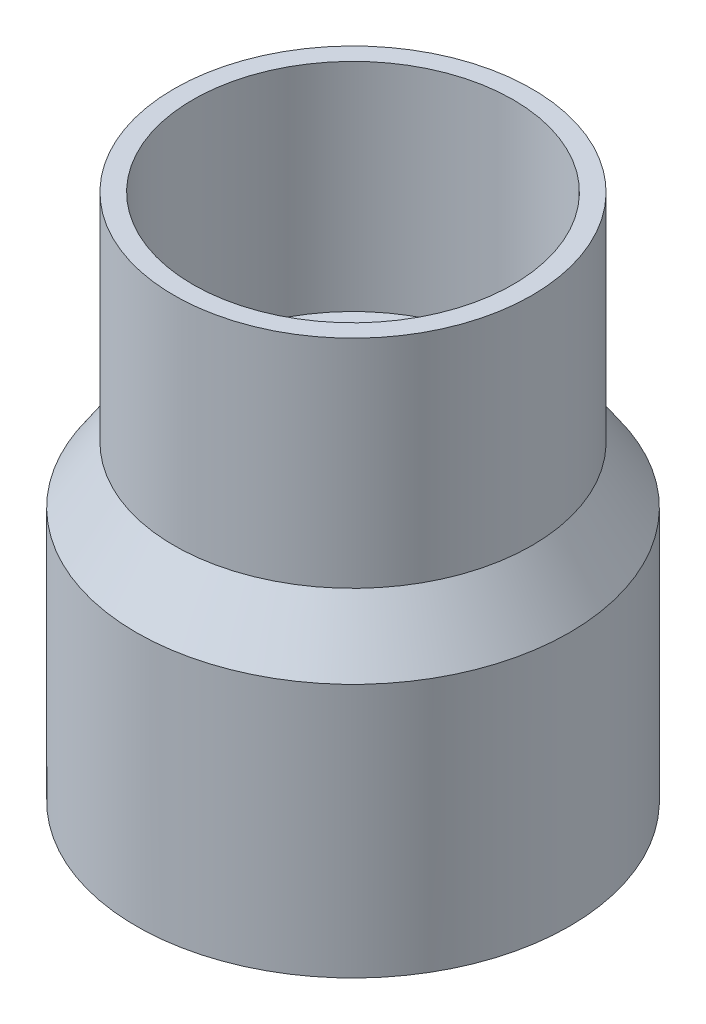
ISO-10303-21;
HEADER;
FILE_DESCRIPTION(('STEP AP214'),'2;1');
FILE_NAME('part.step','',(''),(''),'','','');
FILE_SCHEMA(('AUTOMOTIVE_DESIGN { 1 0 10303 214 1 1 1 1 }'));
ENDSEC;
DATA;
#1=APPLICATION_CONTEXT('core data for automotive mechanical design processes');
#2=APPLICATION_PROTOCOL_DEFINITION('international standard','automotive_design',2000,#1);
#3=PRODUCT_CONTEXT('',#1,'mechanical');
#4=PRODUCT('Part','Part','',(#3));
#5=PRODUCT_RELATED_PRODUCT_CATEGORY('part','',(#4));
#6=PRODUCT_DEFINITION_FORMATION('','',#4);
#7=PRODUCT_DEFINITION_CONTEXT('part definition',#1,'design');
#8=PRODUCT_DEFINITION('design','',#6,#7);
#9=PRODUCT_DEFINITION_SHAPE('','',#8);
#10=(LENGTH_UNIT() NAMED_UNIT(*) SI_UNIT(.MILLI.,.METRE.));
#11=(NAMED_UNIT(*) PLANE_ANGLE_UNIT() SI_UNIT($,.RADIAN.));
#12=(NAMED_UNIT(*) SI_UNIT($,.STERADIAN.) SOLID_ANGLE_UNIT());
#13=UNCERTAINTY_MEASURE_WITH_UNIT(LENGTH_MEASURE(1.E-05),#10,'distance_accuracy_value','');
#14=(GEOMETRIC_REPRESENTATION_CONTEXT(3) GLOBAL_UNCERTAINTY_ASSIGNED_CONTEXT((#13)) GLOBAL_UNIT_ASSIGNED_CONTEXT((#10,
#11,#12)) REPRESENTATION_CONTEXT('',''));
#15=CARTESIAN_POINT('',(0.,0.,0.));
#16=DIRECTION('',(0.,0.,1.));
#17=DIRECTION('',(1.,0.,0.));
#18=AXIS2_PLACEMENT_3D('',#15,#16,#17);
#19=CARTESIAN_POINT('',(0.,0.,0.));
#20=DIRECTION('',(0.,1.,0.));
#21=DIRECTION('',(0.,0.,1.));
#22=AXIS2_PLACEMENT_3D('',#19,#20,#21);
#23=PLANE('',#22);
#24=CARTESIAN_POINT('',(0.,0.,0.));
#25=DIRECTION('',(0.,1.,0.));
#26=DIRECTION('',(1.,0.,0.));
#27=AXIS2_PLACEMENT_3D('',#24,#25,#26);
#28=CIRCLE('',#27,23.);
#29=CARTESIAN_POINT('',(23.,0.,0.));
#30=VERTEX_POINT('',#29);
#31=EDGE_CURVE('E63',#30,#30,#28,.T.);
#32=ORIENTED_EDGE('',*,*,#31,.F.);
#33=EDGE_LOOP('',(#32));
#34=FACE_BOUND('',#33,.T.);
#35=CARTESIAN_POINT('',(0.,0.,0.));
#36=DIRECTION('',(0.,1.,0.));
#37=DIRECTION('',(0.,0.,1.));
#38=AXIS2_PLACEMENT_3D('',#35,#36,#37);
#39=CIRCLE('',#38,21.);
#40=CARTESIAN_POINT('',(0.,0.,21.));
#41=VERTEX_POINT('',#40);
#42=EDGE_CURVE('E69',#41,#41,#39,.T.);
#43=ORIENTED_EDGE('',*,*,#42,.T.);
#44=EDGE_LOOP('',(#43));
#45=FACE_BOUND('',#44,.T.);
#46=ADVANCED_FACE('F50',(#34,#45),#23,.F.);
#47=CARTESIAN_POINT('',(0.,27.,0.));
#48=DIRECTION('',(0.,-1.,0.));
#49=DIRECTION('',(0.,0.,-1.));
#50=AXIS2_PLACEMENT_3D('',#47,#48,#49);
#51=CYLINDRICAL_SURFACE('',#50,23.);
#52=CARTESIAN_POINT('',(0.,27.,0.));
#53=DIRECTION('',(0.,1.,0.));
#54=DIRECTION('',(1.,0.,0.));
#55=AXIS2_PLACEMENT_3D('',#52,#53,#54);
#56=CIRCLE('',#55,23.);
#57=CARTESIAN_POINT('',(23.,27.,0.));
#58=VERTEX_POINT('',#57);
#59=EDGE_CURVE('E58',#58,#58,#56,.T.);
#60=ORIENTED_EDGE('',*,*,#59,.F.);
#61=EDGE_LOOP('',(#60));
#62=FACE_BOUND('',#61,.T.);
#63=ORIENTED_EDGE('',*,*,#31,.T.);
#64=EDGE_LOOP('',(#63));
#65=FACE_BOUND('',#64,.T.);
#66=ADVANCED_FACE('F52',(#62,#65),#51,.T.);
#67=CARTESIAN_POINT('',(0.,27.,0.));
#68=DIRECTION('',(0.,-1.,0.));
#69=DIRECTION('',(0.,0.,-1.));
#70=AXIS2_PLACEMENT_3D('',#67,#68,#69);
#71=CYLINDRICAL_SURFACE('',#70,21.);
#72=CARTESIAN_POINT('',(0.,27.,0.));
#73=DIRECTION('',(0.,1.,0.));
#74=DIRECTION('',(0.,0.,1.));
#75=AXIS2_PLACEMENT_3D('',#72,#73,#74);
#76=CIRCLE('',#75,21.);
#77=CARTESIAN_POINT('',(0.,27.,21.));
#78=VERTEX_POINT('',#77);
#79=EDGE_CURVE('E74',#78,#78,#76,.T.);
#80=ORIENTED_EDGE('',*,*,#79,.T.);
#81=EDGE_LOOP('',(#80));
#82=FACE_BOUND('',#81,.T.);
#83=ORIENTED_EDGE('',*,*,#42,.F.);
#84=EDGE_LOOP('',(#83));
#85=FACE_BOUND('',#84,.T.);
#86=ADVANCED_FACE('F119',(#82,#85),#71,.F.);
#87=CARTESIAN_POINT('',(0.,27.,0.));
#88=DIRECTION('',(0.,1.,0.));
#89=DIRECTION('',(0.,0.,1.));
#90=AXIS2_PLACEMENT_3D('',#87,#88,#89);
#91=PLANE('',#90);
#92=ORIENTED_EDGE('',*,*,#79,.F.);
#93=EDGE_LOOP('',(#92));
#94=FACE_BOUND('',#93,.T.);
#95=ADVANCED_FACE('F110',(#94),#91,.F.);
#96=CARTESIAN_POINT('',(0.,27.,0.));
#97=DIRECTION('',(0.,-1.,0.));
#98=DIRECTION('',(0.,0.,1.));
#99=AXIS2_PLACEMENT_3D('',#96,#97,#98);
#100=CONICAL_SURFACE('',#99,23.,0.593411945678073);
#101=CARTESIAN_POINT('',(0.,33.,0.));
#102=DIRECTION('',(0.,1.,0.));
#103=DIRECTION('',(0.,0.,1.));
#104=AXIS2_PLACEMENT_3D('',#101,#102,#103);
#105=CIRCLE('',#104,18.9529488989454);
#106=CARTESIAN_POINT('',(0.,33.,18.9529488989454));
#107=VERTEX_POINT('',#106);
#108=EDGE_CURVE('E78',#107,#107,#105,.T.);
#109=ORIENTED_EDGE('',*,*,#108,.F.);
#110=EDGE_LOOP('',(#109));
#111=FACE_BOUND('',#110,.T.);
#112=ORIENTED_EDGE('',*,*,#59,.T.);
#113=EDGE_LOOP('',(#112));
#114=FACE_BOUND('',#113,.T.);
#115=ADVANCED_FACE('F100',(#111,#114),#100,.T.);
#116=CARTESIAN_POINT('',(0.,56.,0.));
#117=DIRECTION('',(0.,1.,0.));
#118=DIRECTION('',(0.,0.,1.));
#119=AXIS2_PLACEMENT_3D('',#116,#117,#118);
#120=PLANE('',#119);
#121=CARTESIAN_POINT('',(0.,56.,0.));
#122=DIRECTION('',(0.,1.,0.));
#123=DIRECTION('',(1.,0.,0.));
#124=AXIS2_PLACEMENT_3D('',#121,#122,#123);
#125=CIRCLE('',#124,19.);
#126=CARTESIAN_POINT('',(19.,56.,0.));
#127=VERTEX_POINT('',#126);
#128=EDGE_CURVE('E82',#127,#127,#125,.T.);
#129=ORIENTED_EDGE('',*,*,#128,.T.);
#130=EDGE_LOOP('',(#129));
#131=FACE_BOUND('',#130,.T.);
#132=CARTESIAN_POINT('',(0.,56.,0.));
#133=DIRECTION('',(0.,1.,0.));
#134=DIRECTION('',(0.,0.,1.));
#135=AXIS2_PLACEMENT_3D('',#132,#133,#134);
#136=CIRCLE('',#135,17.);
#137=CARTESIAN_POINT('',(0.,56.,17.));
#138=VERTEX_POINT('',#137);
#139=EDGE_CURVE('E90',#138,#138,#136,.T.);
#140=ORIENTED_EDGE('',*,*,#139,.F.);
#141=EDGE_LOOP('',(#140));
#142=FACE_BOUND('',#141,.T.);
#143=ADVANCED_FACE('F97',(#131,#142),#120,.T.);
#144=CARTESIAN_POINT('',(0.,33.,0.));
#145=DIRECTION('',(0.,1.,0.));
#146=DIRECTION('',(0.,0.,1.));
#147=AXIS2_PLACEMENT_3D('',#144,#145,#146);
#148=PLANE('',#147);
#149=ORIENTED_EDGE('',*,*,#108,.T.);
#150=EDGE_LOOP('',(#149));
#151=FACE_BOUND('',#150,.T.);
#152=CARTESIAN_POINT('',(0.,33.,0.));
#153=DIRECTION('',(0.,1.,0.));
#154=DIRECTION('',(1.,0.,0.));
#155=AXIS2_PLACEMENT_3D('',#152,#153,#154);
#156=CIRCLE('',#155,19.);
#157=CARTESIAN_POINT('',(19.,33.,0.));
#158=VERTEX_POINT('',#157);
#159=EDGE_CURVE('E86',#158,#158,#156,.T.);
#160=ORIENTED_EDGE('',*,*,#159,.F.);
#161=EDGE_LOOP('',(#160));
#162=FACE_BOUND('',#161,.T.);
#163=ADVANCED_FACE('F99',(#151,#162),#148,.F.);
#164=CARTESIAN_POINT('',(0.,56.,0.));
#165=DIRECTION('',(0.,-1.,0.));
#166=DIRECTION('',(0.,0.,-1.));
#167=AXIS2_PLACEMENT_3D('',#164,#165,#166);
#168=CYLINDRICAL_SURFACE('',#167,19.);
#169=ORIENTED_EDGE('',*,*,#128,.F.);
#170=EDGE_LOOP('',(#169));
#171=FACE_BOUND('',#170,.T.);
#172=ORIENTED_EDGE('',*,*,#159,.T.);
#173=EDGE_LOOP('',(#172));
#174=FACE_BOUND('',#173,.T.);
#175=ADVANCED_FACE('F107',(#171,#174),#168,.T.);
#176=CARTESIAN_POINT('',(0.,56.,0.));
#177=DIRECTION('',(0.,-1.,0.));
#178=DIRECTION('',(0.,0.,-1.));
#179=AXIS2_PLACEMENT_3D('',#176,#177,#178);
#180=CYLINDRICAL_SURFACE('',#179,17.);
#181=ORIENTED_EDGE('',*,*,#139,.T.);
#182=EDGE_LOOP('',(#181));
#183=FACE_BOUND('',#182,.T.);
#184=CARTESIAN_POINT('',(0.,33.,0.));
#185=DIRECTION('',(0.,1.,0.));
#186=DIRECTION('',(0.,0.,1.));
#187=AXIS2_PLACEMENT_3D('',#184,#185,#186);
#188=CIRCLE('',#187,17.);
#189=CARTESIAN_POINT('',(0.,33.,17.));
#190=VERTEX_POINT('',#189);
#191=EDGE_CURVE('E12',#190,#190,#188,.F.);
#192=ORIENTED_EDGE('',*,*,#191,.T.);
#193=EDGE_LOOP('',(#192));
#194=FACE_BOUND('',#193,.T.);
#195=ADVANCED_FACE('F95',(#183,#194),#180,.F.);
#196=CARTESIAN_POINT('',(0.,33.,0.));
#197=DIRECTION('',(0.,1.,0.));
#198=DIRECTION('',(0.,0.,1.));
#199=AXIS2_PLACEMENT_3D('',#196,#197,#198);
#200=PLANE('',#199);
#201=ORIENTED_EDGE('',*,*,#191,.F.);
#202=EDGE_LOOP('',(#201));
#203=FACE_BOUND('',#202,.T.);
#204=ADVANCED_FACE('F129',(#203),#200,.T.);
#205=CLOSED_SHELL('',(#46,#66,#86,#95,#115,#143,#163,#175,#195,#204));
#206=MANIFOLD_SOLID_BREP('B2',#205);
#207=ADVANCED_BREP_SHAPE_REPRESENTATION('',(#18,#206),#14);
#208=SHAPE_DEFINITION_REPRESENTATION(#9,#207);
ENDSEC;
END-ISO-10303-21;
